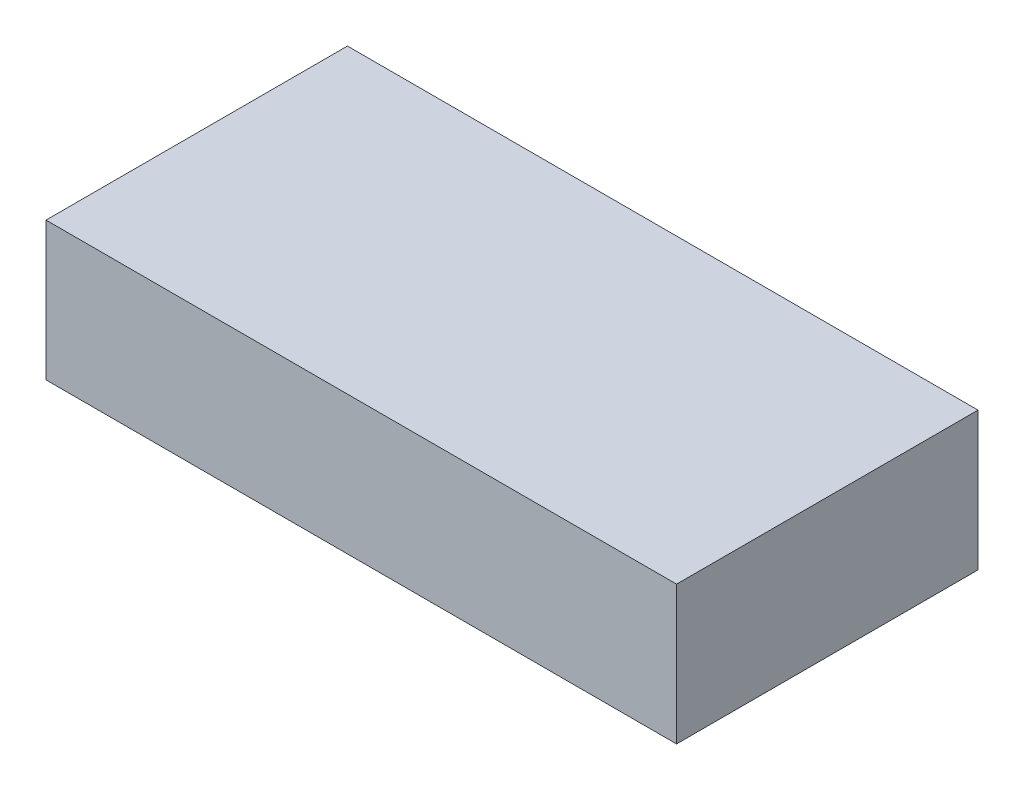
ISO-10303-21;
HEADER;
FILE_DESCRIPTION(('STEP AP214'),'2;1');
FILE_NAME('part.step','',(''),(''),'','','');
FILE_SCHEMA(('AUTOMOTIVE_DESIGN { 1 0 10303 214 1 1 1 1 }'));
ENDSEC;
DATA;
#1=APPLICATION_CONTEXT('core data for automotive mechanical design processes');
#2=APPLICATION_PROTOCOL_DEFINITION('international standard','automotive_design',2000,#1);
#3=PRODUCT_CONTEXT('',#1,'mechanical');
#4=PRODUCT('Part','Part','',(#3));
#5=PRODUCT_RELATED_PRODUCT_CATEGORY('part','',(#4));
#6=PRODUCT_DEFINITION_FORMATION('','',#4);
#7=PRODUCT_DEFINITION_CONTEXT('part definition',#1,'design');
#8=PRODUCT_DEFINITION('design','',#6,#7);
#9=PRODUCT_DEFINITION_SHAPE('','',#8);
#10=(LENGTH_UNIT() NAMED_UNIT(*) SI_UNIT(.MILLI.,.METRE.));
#11=(NAMED_UNIT(*) PLANE_ANGLE_UNIT() SI_UNIT($,.RADIAN.));
#12=(NAMED_UNIT(*) SI_UNIT($,.STERADIAN.) SOLID_ANGLE_UNIT());
#13=UNCERTAINTY_MEASURE_WITH_UNIT(LENGTH_MEASURE(1.E-05),#10,'distance_accuracy_value','');
#14=(GEOMETRIC_REPRESENTATION_CONTEXT(3) GLOBAL_UNCERTAINTY_ASSIGNED_CONTEXT((#13)) GLOBAL_UNIT_ASSIGNED_CONTEXT((#10,
#11,#12)) REPRESENTATION_CONTEXT('',''));
#15=CARTESIAN_POINT('',(0.,0.,0.));
#16=DIRECTION('',(0.,0.,1.));
#17=DIRECTION('',(1.,0.,0.));
#18=AXIS2_PLACEMENT_3D('',#15,#16,#17);
#19=CARTESIAN_POINT('',(102.5,45.,49.));
#20=DIRECTION('',(-1.,0.,0.));
#21=DIRECTION('',(0.,0.,1.));
#22=AXIS2_PLACEMENT_3D('',#19,#20,#21);
#23=PLANE('',#22);
#24=DIRECTION('',(0.,0.,-1.));
#25=VECTOR('',#24,1.);
#26=CARTESIAN_POINT('',(102.5,0.,49.));
#27=LINE('',#26,#25);
#28=CARTESIAN_POINT('',(102.5,0.,49.));
#29=VERTEX_POINT('',#28);
#30=CARTESIAN_POINT('',(102.5,0.,-49.));
#31=VERTEX_POINT('',#30);
#32=EDGE_CURVE('E104',#29,#31,#27,.T.);
#33=ORIENTED_EDGE('',*,*,#32,.T.);
#34=DIRECTION('',(0.,-1.,0.));
#35=VECTOR('',#34,1.);
#36=CARTESIAN_POINT('',(102.5,45.,-49.));
#37=LINE('',#36,#35);
#38=CARTESIAN_POINT('',(102.5,45.,-49.));
#39=VERTEX_POINT('',#38);
#40=EDGE_CURVE('E11',#39,#31,#37,.T.);
#41=ORIENTED_EDGE('',*,*,#40,.F.);
#42=DIRECTION('',(0.,0.,-1.));
#43=VECTOR('',#42,1.);
#44=CARTESIAN_POINT('',(102.5,45.,49.));
#45=LINE('',#44,#43);
#46=CARTESIAN_POINT('',(102.5,45.,49.));
#47=VERTEX_POINT('',#46);
#48=EDGE_CURVE('E92',#47,#39,#45,.T.);
#49=ORIENTED_EDGE('',*,*,#48,.F.);
#50=DIRECTION('',(0.,-1.,0.));
#51=VECTOR('',#50,1.);
#52=CARTESIAN_POINT('',(102.5,45.,49.));
#53=LINE('',#52,#51);
#54=EDGE_CURVE('E100',#47,#29,#53,.T.);
#55=ORIENTED_EDGE('',*,*,#54,.T.);
#56=EDGE_LOOP('',(#33,#41,#49,#55));
#57=FACE_BOUND('',#56,.T.);
#58=ADVANCED_FACE('F41',(#57),#23,.F.);
#59=CARTESIAN_POINT('',(-102.5,45.,-49.));
#60=DIRECTION('',(0.,0.,1.));
#61=DIRECTION('',(1.,0.,0.));
#62=AXIS2_PLACEMENT_3D('',#59,#60,#61);
#63=PLANE('',#62);
#64=DIRECTION('',(-1.,0.,0.));
#65=VECTOR('',#64,1.);
#66=CARTESIAN_POINT('',(-102.5,0.,-49.));
#67=LINE('',#66,#65);
#68=CARTESIAN_POINT('',(-102.5,0.,-49.));
#69=VERTEX_POINT('',#68);
#70=EDGE_CURVE('E96',#31,#69,#67,.T.);
#71=ORIENTED_EDGE('',*,*,#70,.T.);
#72=DIRECTION('',(0.,-1.,0.));
#73=VECTOR('',#72,1.);
#74=CARTESIAN_POINT('',(-102.5,45.,-49.));
#75=LINE('',#74,#73);
#76=CARTESIAN_POINT('',(-102.5,45.,-49.));
#77=VERTEX_POINT('',#76);
#78=EDGE_CURVE('E49',#77,#69,#75,.T.);
#79=ORIENTED_EDGE('',*,*,#78,.F.);
#80=DIRECTION('',(-1.,0.,0.));
#81=VECTOR('',#80,1.);
#82=CARTESIAN_POINT('',(-102.5,45.,-49.));
#83=LINE('',#82,#81);
#84=EDGE_CURVE('E87',#39,#77,#83,.T.);
#85=ORIENTED_EDGE('',*,*,#84,.F.);
#86=ORIENTED_EDGE('',*,*,#40,.T.);
#87=EDGE_LOOP('',(#71,#79,#85,#86));
#88=FACE_BOUND('',#87,.T.);
#89=ADVANCED_FACE('F95',(#88),#63,.F.);
#90=CARTESIAN_POINT('',(-102.5,45.,49.));
#91=DIRECTION('',(1.,0.,0.));
#92=DIRECTION('',(0.,0.,-1.));
#93=AXIS2_PLACEMENT_3D('',#90,#91,#92);
#94=PLANE('',#93);
#95=DIRECTION('',(0.,0.,1.));
#96=VECTOR('',#95,1.);
#97=CARTESIAN_POINT('',(-102.5,0.,49.));
#98=LINE('',#97,#96);
#99=CARTESIAN_POINT('',(-102.5,0.,49.));
#100=VERTEX_POINT('',#99);
#101=EDGE_CURVE('E74',#69,#100,#98,.T.);
#102=ORIENTED_EDGE('',*,*,#101,.T.);
#103=DIRECTION('',(0.,-1.,0.));
#104=VECTOR('',#103,1.);
#105=CARTESIAN_POINT('',(-102.5,45.,49.));
#106=LINE('',#105,#104);
#107=CARTESIAN_POINT('',(-102.5,45.,49.));
#108=VERTEX_POINT('',#107);
#109=EDGE_CURVE('E97',#108,#100,#106,.T.);
#110=ORIENTED_EDGE('',*,*,#109,.F.);
#111=DIRECTION('',(0.,0.,1.));
#112=VECTOR('',#111,1.);
#113=CARTESIAN_POINT('',(-102.5,45.,49.));
#114=LINE('',#113,#112);
#115=EDGE_CURVE('E90',#77,#108,#114,.T.);
#116=ORIENTED_EDGE('',*,*,#115,.F.);
#117=ORIENTED_EDGE('',*,*,#78,.T.);
#118=EDGE_LOOP('',(#102,#110,#116,#117));
#119=FACE_BOUND('',#118,.T.);
#120=ADVANCED_FACE('F98',(#119),#94,.F.);
#121=CARTESIAN_POINT('',(-102.5,45.,49.));
#122=DIRECTION('',(0.,0.,-1.));
#123=DIRECTION('',(-1.,0.,0.));
#124=AXIS2_PLACEMENT_3D('',#121,#122,#123);
#125=PLANE('',#124);
#126=DIRECTION('',(1.,0.,0.));
#127=VECTOR('',#126,1.);
#128=CARTESIAN_POINT('',(-102.5,0.,49.));
#129=LINE('',#128,#127);
#130=EDGE_CURVE('E80',#100,#29,#129,.T.);
#131=ORIENTED_EDGE('',*,*,#130,.T.);
#132=ORIENTED_EDGE('',*,*,#54,.F.);
#133=DIRECTION('',(1.,0.,0.));
#134=VECTOR('',#133,1.);
#135=CARTESIAN_POINT('',(-102.5,45.,49.));
#136=LINE('',#135,#134);
#137=EDGE_CURVE('E57',#108,#47,#136,.T.);
#138=ORIENTED_EDGE('',*,*,#137,.F.);
#139=ORIENTED_EDGE('',*,*,#109,.T.);
#140=EDGE_LOOP('',(#131,#132,#138,#139));
#141=FACE_BOUND('',#140,.T.);
#142=ADVANCED_FACE('F111',(#141),#125,.F.);
#143=CARTESIAN_POINT('',(0.,45.,0.));
#144=DIRECTION('',(0.,-1.,0.));
#145=DIRECTION('',(0.,0.,-1.));
#146=AXIS2_PLACEMENT_3D('',#143,#144,#145);
#147=PLANE('',#146);
#148=ORIENTED_EDGE('',*,*,#48,.T.);
#149=ORIENTED_EDGE('',*,*,#84,.T.);
#150=ORIENTED_EDGE('',*,*,#115,.T.);
#151=ORIENTED_EDGE('',*,*,#137,.T.);
#152=EDGE_LOOP('',(#148,#149,#150,#151));
#153=FACE_BOUND('',#152,.T.);
#154=ADVANCED_FACE('F88',(#153),#147,.F.);
#155=CARTESIAN_POINT('',(0.,0.,0.));
#156=DIRECTION('',(0.,-1.,0.));
#157=DIRECTION('',(0.,0.,-1.));
#158=AXIS2_PLACEMENT_3D('',#155,#156,#157);
#159=PLANE('',#158);
#160=ORIENTED_EDGE('',*,*,#32,.F.);
#161=ORIENTED_EDGE('',*,*,#130,.F.);
#162=ORIENTED_EDGE('',*,*,#101,.F.);
#163=ORIENTED_EDGE('',*,*,#70,.F.);
#164=EDGE_LOOP('',(#160,#161,#162,#163));
#165=FACE_BOUND('',#164,.T.);
#166=ADVANCED_FACE('F114',(#165),#159,.T.);
#167=CLOSED_SHELL('',(#58,#89,#120,#142,#154,#166));
#168=MANIFOLD_SOLID_BREP('B2',#167);
#169=ADVANCED_BREP_SHAPE_REPRESENTATION('',(#18,#168),#14);
#170=SHAPE_DEFINITION_REPRESENTATION(#9,#169);
ENDSEC;
END-ISO-10303-21;
